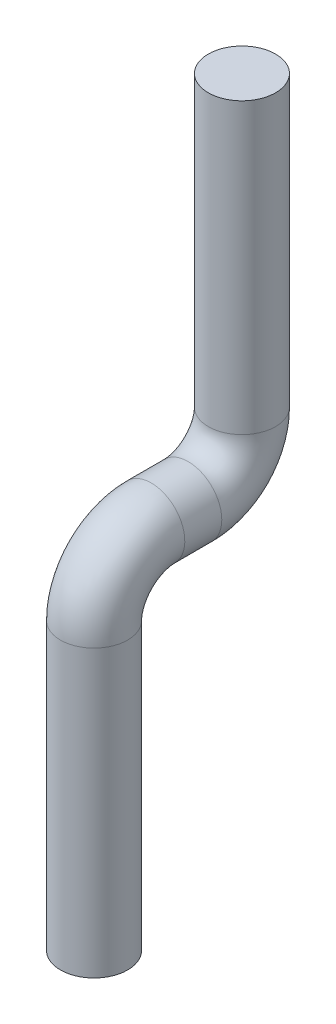
ISO-10303-21;
HEADER;
FILE_DESCRIPTION(('STEP AP214'),'2;1');
FILE_NAME('part.step','',(''),(''),'','','');
FILE_SCHEMA(('AUTOMOTIVE_DESIGN { 1 0 10303 214 1 1 1 1 }'));
ENDSEC;
DATA;
#1=APPLICATION_CONTEXT('core data for automotive mechanical design processes');
#2=APPLICATION_PROTOCOL_DEFINITION('international standard','automotive_design',2000,#1);
#3=PRODUCT_CONTEXT('',#1,'mechanical');
#4=PRODUCT('Part','Part','',(#3));
#5=PRODUCT_RELATED_PRODUCT_CATEGORY('part','',(#4));
#6=PRODUCT_DEFINITION_FORMATION('','',#4);
#7=PRODUCT_DEFINITION_CONTEXT('part definition',#1,'design');
#8=PRODUCT_DEFINITION('design','',#6,#7);
#9=PRODUCT_DEFINITION_SHAPE('','',#8);
#10=(LENGTH_UNIT() NAMED_UNIT(*) SI_UNIT(.MILLI.,.METRE.));
#11=(NAMED_UNIT(*) PLANE_ANGLE_UNIT() SI_UNIT($,.RADIAN.));
#12=(NAMED_UNIT(*) SI_UNIT($,.STERADIAN.) SOLID_ANGLE_UNIT());
#13=UNCERTAINTY_MEASURE_WITH_UNIT(LENGTH_MEASURE(1.E-05),#10,'distance_accuracy_value','');
#14=(GEOMETRIC_REPRESENTATION_CONTEXT(3) GLOBAL_UNCERTAINTY_ASSIGNED_CONTEXT((#13)) GLOBAL_UNIT_ASSIGNED_CONTEXT((#10,
#11,#12)) REPRESENTATION_CONTEXT('',''));
#15=CARTESIAN_POINT('',(0.,0.,0.));
#16=DIRECTION('',(0.,0.,1.));
#17=DIRECTION('',(1.,0.,0.));
#18=AXIS2_PLACEMENT_3D('',#15,#16,#17);
#19=CARTESIAN_POINT('',(0.,-44.8229813664596,22.));
#20=DIRECTION('',(0.,-1.,0.));
#21=DIRECTION('',(0.,0.,-1.));
#22=AXIS2_PLACEMENT_3D('',#19,#20,#21);
#23=PLANE('',#22);
#24=CARTESIAN_POINT('',(0.,-44.8229813664596,22.));
#25=DIRECTION('',(0.,-1.,0.));
#26=DIRECTION('',(0.,0.,-1.));
#27=AXIS2_PLACEMENT_3D('',#24,#25,#26);
#28=CIRCLE('',#27,5.);
#29=CARTESIAN_POINT('',(0.,-44.8229813664596,17.));
#30=VERTEX_POINT('',#29);
#31=EDGE_CURVE('E59',#30,#30,#28,.T.);
#32=ORIENTED_EDGE('',*,*,#31,.T.);
#33=EDGE_LOOP('',(#32));
#34=FACE_BOUND('',#33,.T.);
#35=ADVANCED_FACE('F37',(#34),#23,.T.);
#36=CARTESIAN_POINT('',(0.,57.1770186335404,0.));
#37=DIRECTION('',(0.,-1.,0.));
#38=DIRECTION('',(0.,0.,-1.));
#39=AXIS2_PLACEMENT_3D('',#36,#37,#38);
#40=PLANE('',#39);
#41=CARTESIAN_POINT('',(0.,57.1770186335404,0.));
#42=DIRECTION('',(0.,-1.,0.));
#43=DIRECTION('',(0.,0.,-1.));
#44=AXIS2_PLACEMENT_3D('',#41,#42,#43);
#45=CIRCLE('',#44,5.);
#46=CARTESIAN_POINT('',(0.,57.1770186335404,-5.00000000000001));
#47=VERTEX_POINT('',#46);
#48=EDGE_CURVE('E10',#47,#47,#45,.T.);
#49=ORIENTED_EDGE('',*,*,#48,.F.);
#50=EDGE_LOOP('',(#49));
#51=FACE_BOUND('',#50,.T.);
#52=ADVANCED_FACE('F67',(#51),#40,.F.);
#53=CARTESIAN_POINT('',(0.,-44.8229813664596,22.));
#54=DIRECTION('',(0.,1.,0.));
#55=DIRECTION('',(0.,0.,1.));
#56=AXIS2_PLACEMENT_3D('',#53,#54,#55);
#57=CYLINDRICAL_SURFACE('',#56,5.);
#58=CARTESIAN_POINT('',(0.,-2.32298136645963,22.));
#59=DIRECTION('',(0.,-1.,0.));
#60=DIRECTION('',(0.,0.,-1.));
#61=AXIS2_PLACEMENT_3D('',#58,#59,#60);
#62=CIRCLE('',#61,5.);
#63=CARTESIAN_POINT('',(0.,-2.32298136645963,27.));
#64=VERTEX_POINT('',#63);
#65=EDGE_CURVE('E56',#64,#64,#62,.T.);
#66=ORIENTED_EDGE('',*,*,#65,.T.);
#67=EDGE_LOOP('',(#66));
#68=FACE_BOUND('',#67,.T.);
#69=ORIENTED_EDGE('',*,*,#31,.F.);
#70=EDGE_LOOP('',(#69));
#71=FACE_BOUND('',#70,.T.);
#72=ADVANCED_FACE('F64',(#68,#71),#57,.T.);
#73=CARTESIAN_POINT('',(0.,-2.32298136645963,13.5));
#74=DIRECTION('',(-1.,0.,0.));
#75=DIRECTION('',(0.,0.,1.));
#76=AXIS2_PLACEMENT_3D('',#73,#74,#75);
#77=TOROIDAL_SURFACE('',#76,8.5,5.);
#78=CARTESIAN_POINT('',(0.,6.17701863354038,13.5));
#79=DIRECTION('',(0.,0.,1.));
#80=DIRECTION('',(0.,-1.,0.));
#81=AXIS2_PLACEMENT_3D('',#78,#79,#80);
#82=CIRCLE('',#81,5.);
#83=CARTESIAN_POINT('',(0.,11.1770186335404,13.5));
#84=VERTEX_POINT('',#83);
#85=EDGE_CURVE('E51',#84,#84,#82,.T.);
#86=CARTESIAN_POINT('',(0.,-2.32298136645963,13.5));
#87=DIRECTION('',(-1.,0.,0.));
#88=DIRECTION('',(0.,0.,1.));
#89=AXIS2_PLACEMENT_3D('',#86,#87,#88);
#90=CIRCLE('',#89,13.5);
#91=EDGE_CURVE('',#64,#84,#90,.T.);
#92=ORIENTED_EDGE('',*,*,#65,.F.);
#93=ORIENTED_EDGE('',*,*,#85,.T.);
#94=ORIENTED_EDGE('',*,*,#91,.T.);
#95=ORIENTED_EDGE('',*,*,#91,.F.);
#96=EDGE_LOOP('',(#92,#94,#93,#95));
#97=FACE_BOUND('',#96,.T.);
#98=ADVANCED_FACE('F66',(#97),#77,.T.);
#99=CARTESIAN_POINT('',(0.,6.17701863354037,13.5));
#100=DIRECTION('',(0.,0.,-1.));
#101=DIRECTION('',(-1.,0.,0.));
#102=AXIS2_PLACEMENT_3D('',#99,#100,#101);
#103=CYLINDRICAL_SURFACE('',#102,5.);
#104=CARTESIAN_POINT('',(0.,6.17701863354037,8.));
#105=DIRECTION('',(0.,0.,1.));
#106=DIRECTION('',(0.,-1.,0.));
#107=AXIS2_PLACEMENT_3D('',#104,#105,#106);
#108=CIRCLE('',#107,5.);
#109=CARTESIAN_POINT('',(0.,1.17701863354037,8.));
#110=VERTEX_POINT('',#109);
#111=EDGE_CURVE('E47',#110,#110,#108,.T.);
#112=ORIENTED_EDGE('',*,*,#111,.T.);
#113=EDGE_LOOP('',(#112));
#114=FACE_BOUND('',#113,.T.);
#115=ORIENTED_EDGE('',*,*,#85,.F.);
#116=EDGE_LOOP('',(#115));
#117=FACE_BOUND('',#116,.T.);
#118=ADVANCED_FACE('F74',(#114,#117),#103,.T.);
#119=CARTESIAN_POINT('',(0.,14.1770186335404,8.));
#120=DIRECTION('',(1.,0.,0.));
#121=DIRECTION('',(0.,0.,-1.));
#122=AXIS2_PLACEMENT_3D('',#119,#120,#121);
#123=TOROIDAL_SURFACE('',#122,8.,5.);
#124=CARTESIAN_POINT('',(0.,14.1770186335404,0.));
#125=DIRECTION('',(0.,-1.,0.));
#126=DIRECTION('',(0.,0.,-1.));
#127=AXIS2_PLACEMENT_3D('',#124,#125,#126);
#128=CIRCLE('',#127,5.);
#129=CARTESIAN_POINT('',(0.,14.1770186335404,-5.));
#130=VERTEX_POINT('',#129);
#131=EDGE_CURVE('E43',#130,#130,#128,.T.);
#132=CARTESIAN_POINT('',(0.,14.1770186335404,8.));
#133=DIRECTION('',(1.,0.,0.));
#134=DIRECTION('',(0.,0.,-1.));
#135=AXIS2_PLACEMENT_3D('',#132,#133,#134);
#136=CIRCLE('',#135,13.);
#137=EDGE_CURVE('',#110,#130,#136,.T.);
#138=ORIENTED_EDGE('',*,*,#111,.F.);
#139=ORIENTED_EDGE('',*,*,#131,.T.);
#140=ORIENTED_EDGE('',*,*,#137,.T.);
#141=ORIENTED_EDGE('',*,*,#137,.F.);
#142=EDGE_LOOP('',(#138,#140,#139,#141));
#143=FACE_BOUND('',#142,.T.);
#144=ADVANCED_FACE('F80',(#143),#123,.T.);
#145=CARTESIAN_POINT('',(0.,14.1770186335404,0.));
#146=DIRECTION('',(0.,1.,0.));
#147=DIRECTION('',(0.,0.,1.));
#148=AXIS2_PLACEMENT_3D('',#145,#146,#147);
#149=CYLINDRICAL_SURFACE('',#148,5.);
#150=ORIENTED_EDGE('',*,*,#48,.T.);
#151=EDGE_LOOP('',(#150));
#152=FACE_BOUND('',#151,.T.);
#153=ORIENTED_EDGE('',*,*,#131,.F.);
#154=EDGE_LOOP('',(#153));
#155=FACE_BOUND('',#154,.T.);
#156=ADVANCED_FACE('F78',(#152,#155),#149,.T.);
#157=CLOSED_SHELL('',(#35,#52,#72,#98,#118,#144,#156));
#158=MANIFOLD_SOLID_BREP('B2',#157);
#159=ADVANCED_BREP_SHAPE_REPRESENTATION('',(#18,#158),#14);
#160=SHAPE_DEFINITION_REPRESENTATION(#9,#159);
ENDSEC;
END-ISO-10303-21;
